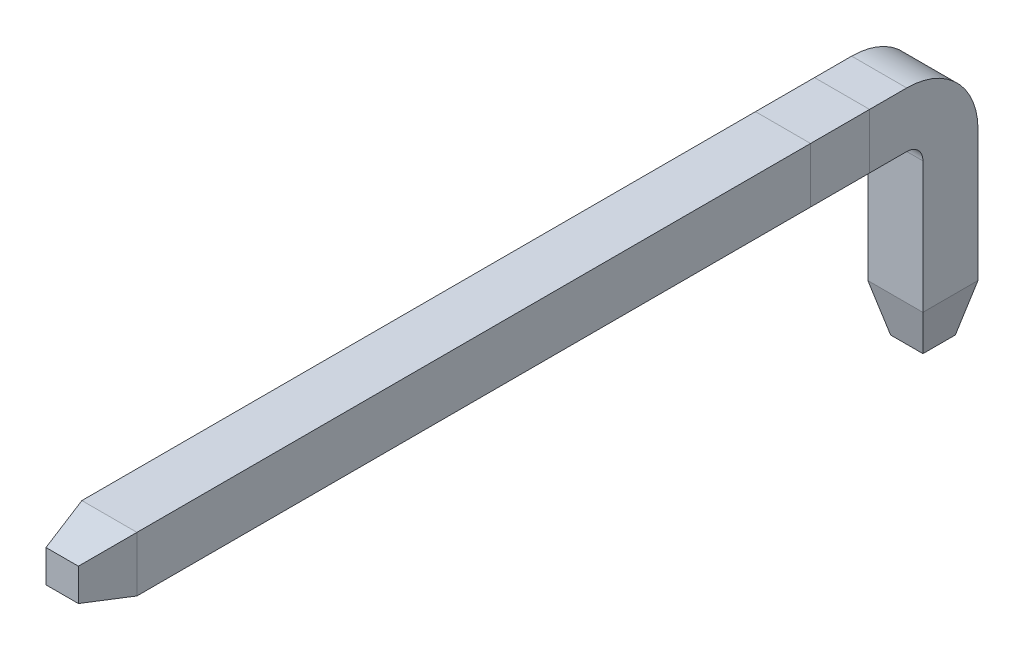
ISO-10303-21;
HEADER;
FILE_DESCRIPTION(('STEP AP214'),'2;1');
FILE_NAME('part.step','',(''),(''),'','','');
FILE_SCHEMA(('AUTOMOTIVE_DESIGN { 1 0 10303 214 1 1 1 1 }'));
ENDSEC;
DATA;
#1=APPLICATION_CONTEXT('core data for automotive mechanical design processes');
#2=APPLICATION_PROTOCOL_DEFINITION('international standard','automotive_design',2000,#1);
#3=PRODUCT_CONTEXT('',#1,'mechanical');
#4=PRODUCT('Part','Part','',(#3));
#5=PRODUCT_RELATED_PRODUCT_CATEGORY('part','',(#4));
#6=PRODUCT_DEFINITION_FORMATION('','',#4);
#7=PRODUCT_DEFINITION_CONTEXT('part definition',#1,'design');
#8=PRODUCT_DEFINITION('design','',#6,#7);
#9=PRODUCT_DEFINITION_SHAPE('','',#8);
#10=(LENGTH_UNIT() NAMED_UNIT(*) SI_UNIT(.MILLI.,.METRE.));
#11=(NAMED_UNIT(*) PLANE_ANGLE_UNIT() SI_UNIT($,.RADIAN.));
#12=(NAMED_UNIT(*) SI_UNIT($,.STERADIAN.) SOLID_ANGLE_UNIT());
#13=UNCERTAINTY_MEASURE_WITH_UNIT(LENGTH_MEASURE(1.E-05),#10,'distance_accuracy_value','');
#14=(GEOMETRIC_REPRESENTATION_CONTEXT(3) GLOBAL_UNCERTAINTY_ASSIGNED_CONTEXT((#13)) GLOBAL_UNIT_ASSIGNED_CONTEXT((#10,
#11,#12)) REPRESENTATION_CONTEXT('',''));
#15=CARTESIAN_POINT('',(0.,0.,0.));
#16=DIRECTION('',(0.,0.,1.));
#17=DIRECTION('',(1.,0.,0.));
#18=AXIS2_PLACEMENT_3D('',#15,#16,#17);
#19=CARTESIAN_POINT('',(4.102,-0.315,2.025));
#20=DIRECTION('',(0.,-1.,0.));
#21=DIRECTION('',(0.,0.,-1.));
#22=AXIS2_PLACEMENT_3D('',#19,#20,#21);
#23=PLANE('',#22);
#24=DIRECTION('',(0.,0.,1.));
#25=VECTOR('',#24,1.);
#26=CARTESIAN_POINT('',(4.765,-0.315,-0.1915));
#27=LINE('',#26,#25);
#28=CARTESIAN_POINT('',(4.765,-0.315,1.24005256704126));
#29=VERTEX_POINT('',#28);
#30=CARTESIAN_POINT('',(4.765,-0.315,1.915));
#31=VERTEX_POINT('',#30);
#32=EDGE_CURVE('E11',#29,#31,#27,.T.);
#33=ORIENTED_EDGE('',*,*,#32,.F.);
#34=DIRECTION('',(1.,0.,0.));
#35=VECTOR('',#34,1.);
#36=CARTESIAN_POINT('',(4.102,-0.315,1.24005256704126));
#37=LINE('',#36,#35);
#38=CARTESIAN_POINT('',(5.395,-0.315,1.24005256704126));
#39=VERTEX_POINT('',#38);
#40=EDGE_CURVE('E25',#29,#39,#37,.T.);
#41=ORIENTED_EDGE('',*,*,#40,.T.);
#42=DIRECTION('',(0.,0.,-1.));
#43=VECTOR('',#42,1.);
#44=CARTESIAN_POINT('',(5.395,-0.315,-0.1915));
#45=LINE('',#44,#43);
#46=CARTESIAN_POINT('',(5.395,-0.315,1.915));
#47=VERTEX_POINT('',#46);
#48=EDGE_CURVE('E373',#47,#39,#45,.T.);
#49=ORIENTED_EDGE('',*,*,#48,.F.);
#50=DIRECTION('',(1.,0.,0.));
#51=VECTOR('',#50,1.);
#52=CARTESIAN_POINT('',(4.102,-0.315,1.915));
#53=LINE('',#52,#51);
#54=EDGE_CURVE('E369',#31,#47,#53,.T.);
#55=ORIENTED_EDGE('',*,*,#54,.F.);
#56=EDGE_LOOP('',(#33,#41,#49,#55));
#57=FACE_BOUND('',#56,.T.);
#58=ADVANCED_FACE('F17',(#57),#23,.T.);
#59=CARTESIAN_POINT('',(4.102,0.315,0.705));
#60=DIRECTION('',(0.,1.,0.));
#61=DIRECTION('',(1.,0.,0.));
#62=AXIS2_PLACEMENT_3D('',#59,#60,#61);
#63=PLANE('',#62);
#64=DIRECTION('',(0.,0.,-1.));
#65=VECTOR('',#64,1.);
#66=CARTESIAN_POINT('',(5.395,0.315,0.705));
#67=LINE('',#66,#65);
#68=CARTESIAN_POINT('',(5.395,0.315,1.915));
#69=VERTEX_POINT('',#68);
#70=CARTESIAN_POINT('',(5.395,0.315,1.24005256704126));
#71=VERTEX_POINT('',#70);
#72=EDGE_CURVE('E366',#69,#71,#67,.T.);
#73=ORIENTED_EDGE('',*,*,#72,.T.);
#74=DIRECTION('',(-1.,0.,0.));
#75=VECTOR('',#74,1.);
#76=CARTESIAN_POINT('',(4.102,0.315,1.24005256704126));
#77=LINE('',#76,#75);
#78=CARTESIAN_POINT('',(4.765,0.315,1.24005256704126));
#79=VERTEX_POINT('',#78);
#80=EDGE_CURVE('E364',#71,#79,#77,.T.);
#81=ORIENTED_EDGE('',*,*,#80,.T.);
#82=DIRECTION('',(0.,0.,1.));
#83=VECTOR('',#82,1.);
#84=CARTESIAN_POINT('',(4.765,0.315,0.705));
#85=LINE('',#84,#83);
#86=CARTESIAN_POINT('',(4.765,0.315,1.915));
#87=VERTEX_POINT('',#86);
#88=EDGE_CURVE('E361',#79,#87,#85,.T.);
#89=ORIENTED_EDGE('',*,*,#88,.T.);
#90=DIRECTION('',(-1.,0.,0.));
#91=VECTOR('',#90,1.);
#92=CARTESIAN_POINT('',(4.102,0.315,1.915));
#93=LINE('',#92,#91);
#94=EDGE_CURVE('E357',#69,#87,#93,.T.);
#95=ORIENTED_EDGE('',*,*,#94,.F.);
#96=EDGE_LOOP('',(#73,#81,#89,#95));
#97=FACE_BOUND('',#96,.T.);
#98=ADVANCED_FACE('F415',(#97),#63,.T.);
#99=CARTESIAN_POINT('',(4.765,-2.8255,-0.1915));
#100=DIRECTION('',(-1.,0.,0.));
#101=DIRECTION('',(0.,0.,1.));
#102=AXIS2_PLACEMENT_3D('',#99,#100,#101);
#103=PLANE('',#102);
#104=ORIENTED_EDGE('',*,*,#88,.F.);
#105=DIRECTION('',(0.,-1.,0.));
#106=VECTOR('',#105,1.);
#107=CARTESIAN_POINT('',(4.765,-2.8255,1.24005256704126));
#108=LINE('',#107,#106);
#109=EDGE_CURVE('E355',#79,#29,#108,.T.);
#110=ORIENTED_EDGE('',*,*,#109,.T.);
#111=ORIENTED_EDGE('',*,*,#32,.T.);
#112=DIRECTION('',(0.,-1.,0.));
#113=VECTOR('',#112,1.);
#114=CARTESIAN_POINT('',(4.765,-0.978,1.915));
#115=LINE('',#114,#113);
#116=EDGE_CURVE('E351',#87,#31,#115,.T.);
#117=ORIENTED_EDGE('',*,*,#116,.F.);
#118=EDGE_LOOP('',(#104,#110,#111,#117));
#119=FACE_BOUND('',#118,.T.);
#120=ADVANCED_FACE('F417',(#119),#103,.T.);
#121=CARTESIAN_POINT('',(5.395,-2.8255,-0.1915));
#122=DIRECTION('',(1.,0.,0.));
#123=DIRECTION('',(0.,1.,0.));
#124=AXIS2_PLACEMENT_3D('',#121,#122,#123);
#125=PLANE('',#124);
#126=ORIENTED_EDGE('',*,*,#48,.T.);
#127=DIRECTION('',(0.,1.,0.));
#128=VECTOR('',#127,1.);
#129=CARTESIAN_POINT('',(5.395,-2.8255,1.24005256704126));
#130=LINE('',#129,#128);
#131=EDGE_CURVE('E348',#39,#71,#130,.T.);
#132=ORIENTED_EDGE('',*,*,#131,.T.);
#133=ORIENTED_EDGE('',*,*,#72,.F.);
#134=DIRECTION('',(0.,1.,0.));
#135=VECTOR('',#134,1.);
#136=CARTESIAN_POINT('',(5.395,-0.978,1.915));
#137=LINE('',#136,#135);
#138=EDGE_CURVE('E344',#47,#69,#137,.T.);
#139=ORIENTED_EDGE('',*,*,#138,.F.);
#140=EDGE_LOOP('',(#126,#132,#133,#139));
#141=FACE_BOUND('',#140,.T.);
#142=ADVANCED_FACE('F382',(#141),#125,.T.);
#143=CARTESIAN_POINT('',(4.102,-2.54,1.293));
#144=DIRECTION('',(0.,-1.,0.));
#145=DIRECTION('',(0.,0.,-1.));
#146=AXIS2_PLACEMENT_3D('',#143,#144,#145);
#147=PLANE('',#146);
#148=DIRECTION('',(-9.0573847817433E-05,0.,-0.999999995898189));
#149=VECTOR('',#148,1.);
#150=CARTESIAN_POINT('',(5.26512364211145,-2.54,-0.000222915201498876));
#151=LINE('',#150,#149);
#152=CARTESIAN_POINT('',(5.26515047812909,-2.54001212571568,0.499678242049049));
#153=VERTEX_POINT('',#152);
#154=CARTESIAN_POINT('',(5.26513538495763,-2.54,0.12942649701042));
#155=VERTEX_POINT('',#154);
#156=EDGE_CURVE('E339',#153,#155,#151,.T.);
#157=ORIENTED_EDGE('',*,*,#156,.F.);
#158=DIRECTION('',(1.,0.,0.));
#159=VECTOR('',#158,1.);
#160=CARTESIAN_POINT('',(5.39499999984772,-2.54,0.499730833388735));
#161=LINE('',#160,#159);
#162=CARTESIAN_POINT('',(4.89484952156635,-2.54001212571568,0.499678242049049));
#163=VERTEX_POINT('',#162);
#164=EDGE_CURVE('E333',#163,#153,#161,.T.);
#165=ORIENTED_EDGE('',*,*,#164,.F.);
#166=DIRECTION('',(-9.05738478171178E-05,0.,0.999999995898189));
#167=VECTOR('',#166,1.);
#168=CARTESIAN_POINT('',(4.89481929606415,-2.54,0.629777034937407));
#169=LINE('',#168,#167);
#170=CARTESIAN_POINT('',(4.89486461473781,-2.54,0.12942649701042));
#171=VERTEX_POINT('',#170);
#172=EDGE_CURVE('E327',#171,#163,#169,.T.);
#173=ORIENTED_EDGE('',*,*,#172,.F.);
#174=DIRECTION('',(-1.,0.,0.));
#175=VECTOR('',#174,1.);
#176=CARTESIAN_POINT('',(4.76499999984772,-2.54,0.12942649701042));
#177=LINE('',#176,#175);
#178=EDGE_CURVE('E323',#155,#171,#177,.T.);
#179=ORIENTED_EDGE('',*,*,#178,.F.);
#180=EDGE_LOOP('',(#157,#165,#173,#179));
#181=FACE_BOUND('',#180,.T.);
#182=ADVANCED_FACE('F452',(#181),#147,.T.);
#183=CARTESIAN_POINT('',(5.39499999984772,-2.00011653491076,0.629765276704178));
#184=DIRECTION('',(0.,-0.234160215533744,0.972198021732811));
#185=DIRECTION('',(-1.,0.,0.));
#186=AXIS2_PLACEMENT_3D('',#183,#184,#185);
#187=PLANE('',#186);
#188=DIRECTION('',(-0.227655002210226,0.946669905004515,0.228011602615756));
#189=VECTOR('',#188,1.);
#190=CARTESIAN_POINT('',(4.76499999984772,-2.00011653491076,0.629765276704179));
#191=LINE('',#190,#189);
#192=CARTESIAN_POINT('',(4.76499999971291,-2.00010401844251,0.629886441826773));
#193=VERTEX_POINT('',#192);
#194=EDGE_CURVE('E318',#163,#193,#191,.T.);
#195=ORIENTED_EDGE('',*,*,#194,.F.);
#196=ORIENTED_EDGE('',*,*,#164,.T.);
#197=DIRECTION('',(-0.227655002210229,-0.946669905004514,-0.228011602615756));
#198=VECTOR('',#197,1.);
#199=CARTESIAN_POINT('',(5.36234911582798,-2.13589044267994,0.597063248108785));
#200=LINE('',#199,#198);
#201=CARTESIAN_POINT('',(5.395000000207,-2.00010401843991,0.629886441828584));
#202=VERTEX_POINT('',#201);
#203=EDGE_CURVE('E312',#202,#153,#200,.T.);
#204=ORIENTED_EDGE('',*,*,#203,.F.);
#205=DIRECTION('',(1.,0.,0.));
#206=VECTOR('',#205,1.);
#207=CARTESIAN_POINT('',(4.102,-1.9991419990643,0.63));
#208=LINE('',#207,#206);
#209=EDGE_CURVE('E306',#193,#202,#208,.T.);
#210=ORIENTED_EDGE('',*,*,#209,.F.);
#211=EDGE_LOOP('',(#195,#196,#204,#210));
#212=FACE_BOUND('',#211,.T.);
#213=ADVANCED_FACE('F455',(#212),#187,.T.);
#214=CARTESIAN_POINT('',(5.39499999984772,-1.99987923142851,-0.000234678603007815));
#215=DIRECTION('',(0.972286154406281,-0.233793982374717,-8.80636985454124E-05));
#216=DIRECTION('',(0.,0.00037667219405563,-0.999999929059027));
#217=AXIS2_PLACEMENT_3D('',#214,#215,#216);
#218=PLANE('',#217);
#219=ORIENTED_EDGE('',*,*,#203,.T.);
#220=ORIENTED_EDGE('',*,*,#156,.T.);
#221=DIRECTION('',(-0.227655002210229,-0.946841407622854,0.227298369504565));
#222=VECTOR('',#221,1.);
#223=CARTESIAN_POINT('',(5.36234911582798,-2.13567773655794,0.0323650562085163));
#224=LINE('',#223,#222);
#225=CARTESIAN_POINT('',(5.39500000020594,-1.99989171173503,-0.000113559496830514));
#226=VERTEX_POINT('',#225);
#227=EDGE_CURVE('E300',#226,#155,#224,.T.);
#228=ORIENTED_EDGE('',*,*,#227,.F.);
#229=DIRECTION('',(0.,0.000376672180686717,-0.999999929059032));
#230=VECTOR('',#229,1.);
#231=CARTESIAN_POINT('',(5.395,-2.00011653491076,0.629882638352091));
#232=LINE('',#231,#230);
#233=EDGE_CURVE('E294',#202,#226,#232,.T.);
#234=ORIENTED_EDGE('',*,*,#233,.F.);
#235=EDGE_LOOP('',(#219,#220,#228,#234));
#236=FACE_BOUND('',#235,.T.);
#237=ADVANCED_FACE('F459',(#236),#218,.T.);
#238=CARTESIAN_POINT('',(4.76499999984772,-1.99987923142851,-0.000234678603007951));
#239=DIRECTION('',(0.,-0.233427749215686,-0.972374149129901));
#240=DIRECTION('',(0.,-0.972374149129901,0.233427749215686));
#241=AXIS2_PLACEMENT_3D('',#238,#239,#240);
#242=PLANE('',#241);
#243=ORIENTED_EDGE('',*,*,#227,.T.);
#244=ORIENTED_EDGE('',*,*,#178,.T.);
#245=DIRECTION('',(0.227655002210226,-0.946841407622855,0.227298369504564));
#246=VECTOR('',#245,1.);
#247=CARTESIAN_POINT('',(4.79765088386746,-2.13567773655793,0.0323650562085151));
#248=LINE('',#247,#246);
#249=CARTESIAN_POINT('',(4.76499999971399,-1.99989171173759,-0.000113559495025156));
#250=VERTEX_POINT('',#249);
#251=EDGE_CURVE('E288',#250,#171,#248,.T.);
#252=ORIENTED_EDGE('',*,*,#251,.F.);
#253=DIRECTION('',(-1.,0.,0.));
#254=VECTOR('',#253,1.);
#255=CARTESIAN_POINT('',(4.102,-2.00085681617448,0.));
#256=LINE('',#255,#254);
#257=EDGE_CURVE('E282',#226,#250,#256,.T.);
#258=ORIENTED_EDGE('',*,*,#257,.F.);
#259=EDGE_LOOP('',(#243,#244,#252,#258));
#260=FACE_BOUND('',#259,.T.);
#261=ADVANCED_FACE('F402',(#260),#242,.T.);
#262=CARTESIAN_POINT('',(4.76499999984772,-2.00011653491076,0.629765276704179));
#263=DIRECTION('',(-0.972286154406282,-0.233793982374713,-8.8063698545106E-05));
#264=DIRECTION('',(-0.233793983281274,0.972286158176427,0.));
#265=AXIS2_PLACEMENT_3D('',#262,#263,#264);
#266=PLANE('',#265);
#267=ORIENTED_EDGE('',*,*,#251,.T.);
#268=ORIENTED_EDGE('',*,*,#172,.T.);
#269=ORIENTED_EDGE('',*,*,#194,.T.);
#270=DIRECTION('',(0.,-0.000376672180686717,0.999999929059032));
#271=VECTOR('',#270,1.);
#272=CARTESIAN_POINT('',(4.765,-1.99987923142851,-0.00011733930150299));
#273=LINE('',#272,#271);
#274=EDGE_CURVE('E276',#250,#193,#273,.T.);
#275=ORIENTED_EDGE('',*,*,#274,.F.);
#276=EDGE_LOOP('',(#267,#268,#269,#275));
#277=FACE_BOUND('',#276,.T.);
#278=ADVANCED_FACE('F465',(#277),#266,.T.);
#279=CARTESIAN_POINT('',(4.102,-0.296,0.63));
#280=DIRECTION('',(0.,0.,1.));
#281=DIRECTION('',(1.,0.,0.));
#282=AXIS2_PLACEMENT_3D('',#279,#280,#281);
#283=PLANE('',#282);
#284=DIRECTION('',(0.,1.,0.));
#285=VECTOR('',#284,1.);
#286=CARTESIAN_POINT('',(4.765,-2.8255,0.63));
#287=LINE('',#286,#285);
#288=CARTESIAN_POINT('',(4.765,-0.5,0.63));
#289=VERTEX_POINT('',#288);
#290=EDGE_CURVE('E271',#193,#289,#287,.T.);
#291=ORIENTED_EDGE('',*,*,#290,.F.);
#292=ORIENTED_EDGE('',*,*,#209,.T.);
#293=DIRECTION('',(0.,-1.,0.));
#294=VECTOR('',#293,1.);
#295=CARTESIAN_POINT('',(5.395,-2.8255,0.63));
#296=LINE('',#295,#294);
#297=CARTESIAN_POINT('',(5.395,-0.5,0.63));
#298=VERTEX_POINT('',#297);
#299=EDGE_CURVE('E265',#298,#202,#296,.T.);
#300=ORIENTED_EDGE('',*,*,#299,.F.);
#301=DIRECTION('',(1.,0.,0.));
#302=VECTOR('',#301,1.);
#303=CARTESIAN_POINT('',(4.702,-0.5,0.63));
#304=LINE('',#303,#302);
#305=EDGE_CURVE('E261',#289,#298,#304,.T.);
#306=ORIENTED_EDGE('',*,*,#305,.F.);
#307=EDGE_LOOP('',(#291,#292,#300,#306));
#308=FACE_BOUND('',#307,.T.);
#309=ADVANCED_FACE('F397',(#308),#283,.T.);
#310=CARTESIAN_POINT('',(4.702,-0.5,0.815));
#311=DIRECTION('',(1.,0.,0.));
#312=DIRECTION('',(0.,0.,-1.));
#313=AXIS2_PLACEMENT_3D('',#310,#311,#312);
#314=CYLINDRICAL_SURFACE('',#313,0.185);
#315=ORIENTED_EDGE('',*,*,#305,.T.);
#316=CARTESIAN_POINT('',(5.395,-0.5,0.815));
#317=DIRECTION('',(-1.,0.,0.));
#318=DIRECTION('',(0.,0.,-1.));
#319=AXIS2_PLACEMENT_3D('',#316,#317,#318);
#320=CIRCLE('',#319,0.185);
#321=CARTESIAN_POINT('',(5.395,-0.315,0.815));
#322=VERTEX_POINT('',#321);
#323=EDGE_CURVE('E257',#322,#298,#320,.T.);
#324=ORIENTED_EDGE('',*,*,#323,.F.);
#325=DIRECTION('',(1.,0.,0.));
#326=VECTOR('',#325,1.);
#327=CARTESIAN_POINT('',(4.102,-0.315,0.815));
#328=LINE('',#327,#326);
#329=CARTESIAN_POINT('',(4.765,-0.315,0.815));
#330=VERTEX_POINT('',#329);
#331=EDGE_CURVE('E253',#330,#322,#328,.T.);
#332=ORIENTED_EDGE('',*,*,#331,.F.);
#333=CARTESIAN_POINT('',(4.765,-0.5,0.815));
#334=DIRECTION('',(1.,0.,0.));
#335=DIRECTION('',(0.,0.,-1.));
#336=AXIS2_PLACEMENT_3D('',#333,#334,#335);
#337=CIRCLE('',#336,0.185);
#338=EDGE_CURVE('E249',#289,#330,#337,.T.);
#339=ORIENTED_EDGE('',*,*,#338,.F.);
#340=EDGE_LOOP('',(#315,#324,#332,#339));
#341=FACE_BOUND('',#340,.T.);
#342=ADVANCED_FACE('F389',(#341),#314,.F.);
#343=CARTESIAN_POINT('',(4.102,-0.315,2.025));
#344=DIRECTION('',(0.,-1.,0.));
#345=DIRECTION('',(0.,0.,-1.));
#346=AXIS2_PLACEMENT_3D('',#343,#344,#345);
#347=PLANE('',#346);
#348=ORIENTED_EDGE('',*,*,#40,.F.);
#349=DIRECTION('',(0.,0.,1.));
#350=VECTOR('',#349,1.);
#351=CARTESIAN_POINT('',(4.765,-0.315,-0.1915));
#352=LINE('',#351,#350);
#353=EDGE_CURVE('E245',#330,#29,#352,.T.);
#354=ORIENTED_EDGE('',*,*,#353,.F.);
#355=ORIENTED_EDGE('',*,*,#331,.T.);
#356=DIRECTION('',(0.,0.,-1.));
#357=VECTOR('',#356,1.);
#358=CARTESIAN_POINT('',(5.395,-0.315,-0.1915));
#359=LINE('',#358,#357);
#360=EDGE_CURVE('E241',#39,#322,#359,.T.);
#361=ORIENTED_EDGE('',*,*,#360,.F.);
#362=EDGE_LOOP('',(#348,#354,#355,#361));
#363=FACE_BOUND('',#362,.T.);
#364=ADVANCED_FACE('F386',(#363),#347,.T.);
#365=CARTESIAN_POINT('',(5.395,-2.8255,-0.1915));
#366=DIRECTION('',(1.,0.,0.));
#367=DIRECTION('',(0.,1.,0.));
#368=AXIS2_PLACEMENT_3D('',#365,#366,#367);
#369=PLANE('',#368);
#370=ORIENTED_EDGE('',*,*,#131,.F.);
#371=ORIENTED_EDGE('',*,*,#360,.T.);
#372=ORIENTED_EDGE('',*,*,#323,.T.);
#373=ORIENTED_EDGE('',*,*,#299,.T.);
#374=ORIENTED_EDGE('',*,*,#233,.T.);
#375=DIRECTION('',(0.,-1.,0.));
#376=VECTOR('',#375,1.);
#377=CARTESIAN_POINT('',(5.395,-2.744,0.));
#378=LINE('',#377,#376);
#379=CARTESIAN_POINT('',(5.395,-0.5,0.));
#380=VERTEX_POINT('',#379);
#381=EDGE_CURVE('E235',#380,#226,#378,.T.);
#382=ORIENTED_EDGE('',*,*,#381,.F.);
#383=CARTESIAN_POINT('',(5.395,-0.5,0.815));
#384=DIRECTION('',(-1.,0.,0.));
#385=DIRECTION('',(0.,0.,-1.));
#386=AXIS2_PLACEMENT_3D('',#383,#384,#385);
#387=CIRCLE('',#386,0.815);
#388=CARTESIAN_POINT('',(5.395,0.315,0.815));
#389=VERTEX_POINT('',#388);
#390=EDGE_CURVE('E231',#389,#380,#387,.T.);
#391=ORIENTED_EDGE('',*,*,#390,.F.);
#392=DIRECTION('',(0.,0.,-1.));
#393=VECTOR('',#392,1.);
#394=CARTESIAN_POINT('',(5.395,0.315,0.705));
#395=LINE('',#394,#393);
#396=EDGE_CURVE('E227',#71,#389,#395,.T.);
#397=ORIENTED_EDGE('',*,*,#396,.F.);
#398=EDGE_LOOP('',(#370,#371,#372,#373,#374,#382,#391,#397));
#399=FACE_BOUND('',#398,.T.);
#400=ADVANCED_FACE('F385',(#399),#369,.T.);
#401=CARTESIAN_POINT('',(4.102,-2.744,0.));
#402=DIRECTION('',(0.,0.,-1.));
#403=DIRECTION('',(0.,-1.,0.));
#404=AXIS2_PLACEMENT_3D('',#401,#402,#403);
#405=PLANE('',#404);
#406=ORIENTED_EDGE('',*,*,#381,.T.);
#407=ORIENTED_EDGE('',*,*,#257,.T.);
#408=DIRECTION('',(0.,-1.,0.));
#409=VECTOR('',#408,1.);
#410=CARTESIAN_POINT('',(4.765,-2.8255,0.));
#411=LINE('',#410,#409);
#412=CARTESIAN_POINT('',(4.765,-0.5,0.));
#413=VERTEX_POINT('',#412);
#414=EDGE_CURVE('E221',#413,#250,#411,.T.);
#415=ORIENTED_EDGE('',*,*,#414,.F.);
#416=DIRECTION('',(-1.,0.,0.));
#417=VECTOR('',#416,1.);
#418=CARTESIAN_POINT('',(4.702,-0.5,0.));
#419=LINE('',#418,#417);
#420=EDGE_CURVE('E217',#380,#413,#419,.T.);
#421=ORIENTED_EDGE('',*,*,#420,.F.);
#422=EDGE_LOOP('',(#406,#407,#415,#421));
#423=FACE_BOUND('',#422,.T.);
#424=ADVANCED_FACE('F405',(#423),#405,.T.);
#425=CARTESIAN_POINT('',(4.765,-2.8255,-0.1915));
#426=DIRECTION('',(-1.,0.,0.));
#427=DIRECTION('',(0.,0.,1.));
#428=AXIS2_PLACEMENT_3D('',#425,#426,#427);
#429=PLANE('',#428);
#430=ORIENTED_EDGE('',*,*,#109,.F.);
#431=DIRECTION('',(0.,0.,1.));
#432=VECTOR('',#431,1.);
#433=CARTESIAN_POINT('',(4.765,0.315,0.705));
#434=LINE('',#433,#432);
#435=CARTESIAN_POINT('',(4.765,0.315,0.815));
#436=VERTEX_POINT('',#435);
#437=EDGE_CURVE('E213',#436,#79,#434,.T.);
#438=ORIENTED_EDGE('',*,*,#437,.F.);
#439=CARTESIAN_POINT('',(4.765,-0.5,0.815));
#440=DIRECTION('',(1.,0.,0.));
#441=DIRECTION('',(0.,0.,-1.));
#442=AXIS2_PLACEMENT_3D('',#439,#440,#441);
#443=CIRCLE('',#442,0.815);
#444=EDGE_CURVE('E209',#413,#436,#443,.T.);
#445=ORIENTED_EDGE('',*,*,#444,.F.);
#446=ORIENTED_EDGE('',*,*,#414,.T.);
#447=ORIENTED_EDGE('',*,*,#274,.T.);
#448=ORIENTED_EDGE('',*,*,#290,.T.);
#449=ORIENTED_EDGE('',*,*,#338,.T.);
#450=ORIENTED_EDGE('',*,*,#353,.T.);
#451=EDGE_LOOP('',(#430,#438,#445,#446,#447,#448,#449,#450));
#452=FACE_BOUND('',#451,.T.);
#453=ADVANCED_FACE('F392',(#452),#429,.T.);
#454=CARTESIAN_POINT('',(4.102,0.315,0.705));
#455=DIRECTION('',(0.,1.,0.));
#456=DIRECTION('',(1.,0.,0.));
#457=AXIS2_PLACEMENT_3D('',#454,#455,#456);
#458=PLANE('',#457);
#459=ORIENTED_EDGE('',*,*,#80,.F.);
#460=ORIENTED_EDGE('',*,*,#396,.T.);
#461=DIRECTION('',(1.,0.,0.));
#462=VECTOR('',#461,1.);
#463=CARTESIAN_POINT('',(4.702,0.315,0.815));
#464=LINE('',#463,#462);
#465=EDGE_CURVE('E205',#436,#389,#464,.T.);
#466=ORIENTED_EDGE('',*,*,#465,.F.);
#467=ORIENTED_EDGE('',*,*,#437,.T.);
#468=EDGE_LOOP('',(#459,#460,#466,#467));
#469=FACE_BOUND('',#468,.T.);
#470=ADVANCED_FACE('F412',(#469),#458,.T.);
#471=CARTESIAN_POINT('',(4.702,-0.5,0.815));
#472=DIRECTION('',(1.,0.,0.));
#473=DIRECTION('',(0.,0.,-1.));
#474=AXIS2_PLACEMENT_3D('',#471,#472,#473);
#475=CYLINDRICAL_SURFACE('',#474,0.815);
#476=ORIENTED_EDGE('',*,*,#444,.T.);
#477=ORIENTED_EDGE('',*,*,#465,.T.);
#478=ORIENTED_EDGE('',*,*,#390,.T.);
#479=ORIENTED_EDGE('',*,*,#420,.T.);
#480=EDGE_LOOP('',(#476,#477,#478,#479));
#481=FACE_BOUND('',#480,.T.);
#482=ADVANCED_FACE('F408',(#481),#475,.T.);
#483=CARTESIAN_POINT('',(4.765,-0.978,1.085));
#484=DIRECTION('',(-1.,0.,0.));
#485=DIRECTION('',(0.,0.,1.));
#486=AXIS2_PLACEMENT_3D('',#483,#484,#485);
#487=PLANE('',#486);
#488=ORIENTED_EDGE('',*,*,#116,.T.);
#489=DIRECTION('',(0.,0.,-1.));
#490=VECTOR('',#489,1.);
#491=CARTESIAN_POINT('',(4.765,-0.315,11.045));
#492=LINE('',#491,#490);
#493=CARTESIAN_POINT('',(4.765,-0.315,9.61951947145763));
#494=VERTEX_POINT('',#493);
#495=EDGE_CURVE('E201',#494,#31,#492,.T.);
#496=ORIENTED_EDGE('',*,*,#495,.F.);
#497=DIRECTION('',(0.,-1.,0.));
#498=VECTOR('',#497,1.);
#499=CARTESIAN_POINT('',(4.765,0.315,9.61951947145762));
#500=LINE('',#499,#498);
#501=CARTESIAN_POINT('',(4.765,0.315,9.61951947145764));
#502=VERTEX_POINT('',#501);
#503=EDGE_CURVE('E197',#502,#494,#500,.T.);
#504=ORIENTED_EDGE('',*,*,#503,.F.);
#505=DIRECTION('',(0.,0.,1.));
#506=VECTOR('',#505,1.);
#507=CARTESIAN_POINT('',(4.765,0.315,1.085));
#508=LINE('',#507,#506);
#509=EDGE_CURVE('E193',#87,#502,#508,.T.);
#510=ORIENTED_EDGE('',*,*,#509,.F.);
#511=EDGE_LOOP('',(#488,#496,#504,#510));
#512=FACE_BOUND('',#511,.T.);
#513=ADVANCED_FACE('F420',(#512),#487,.T.);
#514=CARTESIAN_POINT('',(4.102,-0.315,11.045));
#515=DIRECTION('',(0.,-1.,0.));
#516=DIRECTION('',(0.,0.,-1.));
#517=AXIS2_PLACEMENT_3D('',#514,#515,#516);
#518=PLANE('',#517);
#519=DIRECTION('',(0.,0.,-1.));
#520=VECTOR('',#519,1.);
#521=CARTESIAN_POINT('',(5.395,-0.315,1.085));
#522=LINE('',#521,#520);
#523=CARTESIAN_POINT('',(5.395,-0.315,9.61951947145762));
#524=VERTEX_POINT('',#523);
#525=EDGE_CURVE('E189',#524,#47,#522,.T.);
#526=ORIENTED_EDGE('',*,*,#525,.F.);
#527=DIRECTION('',(1.,0.,0.));
#528=VECTOR('',#527,1.);
#529=CARTESIAN_POINT('',(4.765,-0.315,9.61951947145762));
#530=LINE('',#529,#528);
#531=EDGE_CURVE('E185',#494,#524,#530,.T.);
#532=ORIENTED_EDGE('',*,*,#531,.F.);
#533=ORIENTED_EDGE('',*,*,#495,.T.);
#534=ORIENTED_EDGE('',*,*,#54,.T.);
#535=EDGE_LOOP('',(#526,#532,#533,#534));
#536=FACE_BOUND('',#535,.T.);
#537=ADVANCED_FACE('F431',(#536),#518,.T.);
#538=CARTESIAN_POINT('',(5.395,-0.978,1.085));
#539=DIRECTION('',(1.,0.,0.));
#540=DIRECTION('',(0.,1.,0.));
#541=AXIS2_PLACEMENT_3D('',#538,#539,#540);
#542=PLANE('',#541);
#543=DIRECTION('',(0.,0.,-1.));
#544=VECTOR('',#543,1.);
#545=CARTESIAN_POINT('',(5.395,0.315,1.085));
#546=LINE('',#545,#544);
#547=CARTESIAN_POINT('',(5.395,0.315,9.6195194714576));
#548=VERTEX_POINT('',#547);
#549=EDGE_CURVE('E181',#548,#69,#546,.T.);
#550=ORIENTED_EDGE('',*,*,#549,.F.);
#551=DIRECTION('',(0.,1.,0.));
#552=VECTOR('',#551,1.);
#553=CARTESIAN_POINT('',(5.395,-0.315,9.61951947145762));
#554=LINE('',#553,#552);
#555=EDGE_CURVE('E134',#524,#548,#554,.T.);
#556=ORIENTED_EDGE('',*,*,#555,.F.);
#557=ORIENTED_EDGE('',*,*,#525,.T.);
#558=ORIENTED_EDGE('',*,*,#138,.T.);
#559=EDGE_LOOP('',(#550,#556,#557,#558));
#560=FACE_BOUND('',#559,.T.);
#561=ADVANCED_FACE('F430',(#560),#542,.T.);
#562=CARTESIAN_POINT('',(4.102,0.315,1.085));
#563=DIRECTION('',(0.,1.,0.));
#564=DIRECTION('',(1.,0.,0.));
#565=AXIS2_PLACEMENT_3D('',#562,#563,#564);
#566=PLANE('',#565);
#567=ORIENTED_EDGE('',*,*,#509,.T.);
#568=DIRECTION('',(-1.,0.,0.));
#569=VECTOR('',#568,1.);
#570=CARTESIAN_POINT('',(5.395,0.315,9.61951947145762));
#571=LINE('',#570,#569);
#572=EDGE_CURVE('E176',#548,#502,#571,.T.);
#573=ORIENTED_EDGE('',*,*,#572,.F.);
#574=ORIENTED_EDGE('',*,*,#549,.T.);
#575=ORIENTED_EDGE('',*,*,#94,.T.);
#576=EDGE_LOOP('',(#567,#573,#574,#575));
#577=FACE_BOUND('',#576,.T.);
#578=ADVANCED_FACE('F422',(#577),#566,.T.);
#579=CARTESIAN_POINT('',(4.765,0.315,9.61951947145762));
#580=DIRECTION('',(-0.972286154406282,0.,0.233793998960287));
#581=DIRECTION('',(0.,1.,0.));
#582=AXIS2_PLACEMENT_3D('',#579,#580,#581);
#583=PLANE('',#582);
#584=DIRECTION('',(-0.227655002210227,-0.227655002210227,-0.946755723477457));
#585=VECTOR('',#584,1.);
#586=CARTESIAN_POINT('',(4.89484732824427,-0.18515267175573,10.1595194714576));
#587=LINE('',#586,#585);
#588=CARTESIAN_POINT('',(4.89484732824426,-0.185152671755728,10.1595194714576));
#589=VERTEX_POINT('',#588);
#590=EDGE_CURVE('E172',#589,#494,#587,.T.);
#591=ORIENTED_EDGE('',*,*,#590,.F.);
#592=DIRECTION('',(0.,-1.,0.));
#593=VECTOR('',#592,1.);
#594=CARTESIAN_POINT('',(4.89484732824426,0.185,10.1595194714576));
#595=LINE('',#594,#593);
#596=CARTESIAN_POINT('',(4.89484732824426,0.18515267175573,10.1595194714576));
#597=VERTEX_POINT('',#596);
#598=EDGE_CURVE('E169',#597,#589,#595,.T.);
#599=ORIENTED_EDGE('',*,*,#598,.F.);
#600=DIRECTION('',(0.227655002210214,-0.227655002210229,0.94675572347746));
#601=VECTOR('',#600,1.);
#602=CARTESIAN_POINT('',(4.765,0.315,9.61951947145762));
#603=LINE('',#602,#601);
#604=EDGE_CURVE('E154',#502,#597,#603,.T.);
#605=ORIENTED_EDGE('',*,*,#604,.F.);
#606=ORIENTED_EDGE('',*,*,#503,.T.);
#607=EDGE_LOOP('',(#591,#599,#605,#606));
#608=FACE_BOUND('',#607,.T.);
#609=ADVANCED_FACE('F424',(#608),#583,.T.);
#610=CARTESIAN_POINT('',(4.765,-0.315,9.61951947145762));
#611=DIRECTION('',(0.,-0.972286154406282,0.233793998960289));
#612=DIRECTION('',(-1.,0.,0.));
#613=AXIS2_PLACEMENT_3D('',#610,#611,#612);
#614=PLANE('',#613);
#615=DIRECTION('',(0.22765500221023,-0.227655002210237,-0.946755723477454));
#616=VECTOR('',#615,1.);
#617=CARTESIAN_POINT('',(5.26515267175572,-0.185152671755725,10.1595194714576));
#618=LINE('',#617,#616);
#619=CARTESIAN_POINT('',(5.26515267175572,-0.185152671755725,10.1595194714576));
#620=VERTEX_POINT('',#619);
#621=EDGE_CURVE('E164',#620,#524,#618,.T.);
#622=ORIENTED_EDGE('',*,*,#621,.F.);
#623=DIRECTION('',(1.,0.,0.));
#624=VECTOR('',#623,1.);
#625=CARTESIAN_POINT('',(5.464,-0.185152671755725,10.1595194714576));
#626=LINE('',#625,#624);
#627=EDGE_CURVE('E140',#589,#620,#626,.T.);
#628=ORIENTED_EDGE('',*,*,#627,.F.);
#629=ORIENTED_EDGE('',*,*,#590,.T.);
#630=ORIENTED_EDGE('',*,*,#531,.T.);
#631=EDGE_LOOP('',(#622,#628,#629,#630));
#632=FACE_BOUND('',#631,.T.);
#633=ADVANCED_FACE('F427',(#632),#614,.T.);
#634=CARTESIAN_POINT('',(5.395,-0.315,9.61951947145762));
#635=DIRECTION('',(0.972286154406281,0.,0.233793998960291));
#636=DIRECTION('',(0.,-1.,0.));
#637=AXIS2_PLACEMENT_3D('',#634,#635,#636);
#638=PLANE('',#637);
#639=DIRECTION('',(0.227655002210209,0.227655002210229,-0.946755723477461));
#640=VECTOR('',#639,1.);
#641=CARTESIAN_POINT('',(5.26514432677344,0.185144326773435,10.1595541759871));
#642=LINE('',#641,#640);
#643=CARTESIAN_POINT('',(5.26515267175573,0.18515267175573,10.1595194714576));
#644=VERTEX_POINT('',#643);
#645=EDGE_CURVE('E128',#644,#548,#642,.T.);
#646=ORIENTED_EDGE('',*,*,#645,.F.);
#647=DIRECTION('',(0.,1.,0.));
#648=VECTOR('',#647,1.);
#649=CARTESIAN_POINT('',(5.26515267175572,0.185,10.1595194714576));
#650=LINE('',#649,#648);
#651=EDGE_CURVE('E132',#620,#644,#650,.T.);
#652=ORIENTED_EDGE('',*,*,#651,.F.);
#653=ORIENTED_EDGE('',*,*,#621,.T.);
#654=ORIENTED_EDGE('',*,*,#555,.T.);
#655=EDGE_LOOP('',(#646,#652,#653,#654));
#656=FACE_BOUND('',#655,.T.);
#657=ADVANCED_FACE('F130',(#656),#638,.T.);
#658=CARTESIAN_POINT('',(5.395,0.315,9.61951947145762));
#659=DIRECTION('',(0.,0.972286154406282,0.233793998960289));
#660=DIRECTION('',(1.,0.,0.));
#661=AXIS2_PLACEMENT_3D('',#658,#659,#660);
#662=PLANE('',#661);
#663=ORIENTED_EDGE('',*,*,#604,.T.);
#664=DIRECTION('',(-1.,0.,0.));
#665=VECTOR('',#664,1.);
#666=CARTESIAN_POINT('',(5.464,0.18515267175573,10.1595194714576));
#667=LINE('',#666,#665);
#668=EDGE_CURVE('E147',#644,#597,#667,.T.);
#669=ORIENTED_EDGE('',*,*,#668,.F.);
#670=ORIENTED_EDGE('',*,*,#645,.T.);
#671=ORIENTED_EDGE('',*,*,#572,.T.);
#672=EDGE_LOOP('',(#663,#669,#670,#671));
#673=FACE_BOUND('',#672,.T.);
#674=ADVANCED_FACE('F152',(#673),#662,.T.);
#675=CARTESIAN_POINT('',(5.464,0.185,10.1595194714576));
#676=DIRECTION('',(0.,0.,1.));
#677=DIRECTION('',(1.,0.,0.));
#678=AXIS2_PLACEMENT_3D('',#675,#676,#677);
#679=PLANE('',#678);
#680=ORIENTED_EDGE('',*,*,#651,.T.);
#681=ORIENTED_EDGE('',*,*,#668,.T.);
#682=ORIENTED_EDGE('',*,*,#598,.T.);
#683=ORIENTED_EDGE('',*,*,#627,.T.);
#684=EDGE_LOOP('',(#680,#681,#682,#683));
#685=FACE_BOUND('',#684,.T.);
#686=ADVANCED_FACE('F145',(#685),#679,.T.);
#687=CLOSED_SHELL('',(#58,#98,#120,#142,#182,#213,#237,#261,#278,#309,#342,#364,#400,#424,#453,
#470,#482,#513,#537,#561,#578,#609,#633,#657,#674,#686));
#688=MANIFOLD_SOLID_BREP('B1',#687);
#689=ADVANCED_BREP_SHAPE_REPRESENTATION('',(#18,#688),#14);
#690=SHAPE_DEFINITION_REPRESENTATION(#9,#689);
ENDSEC;
END-ISO-10303-21;
